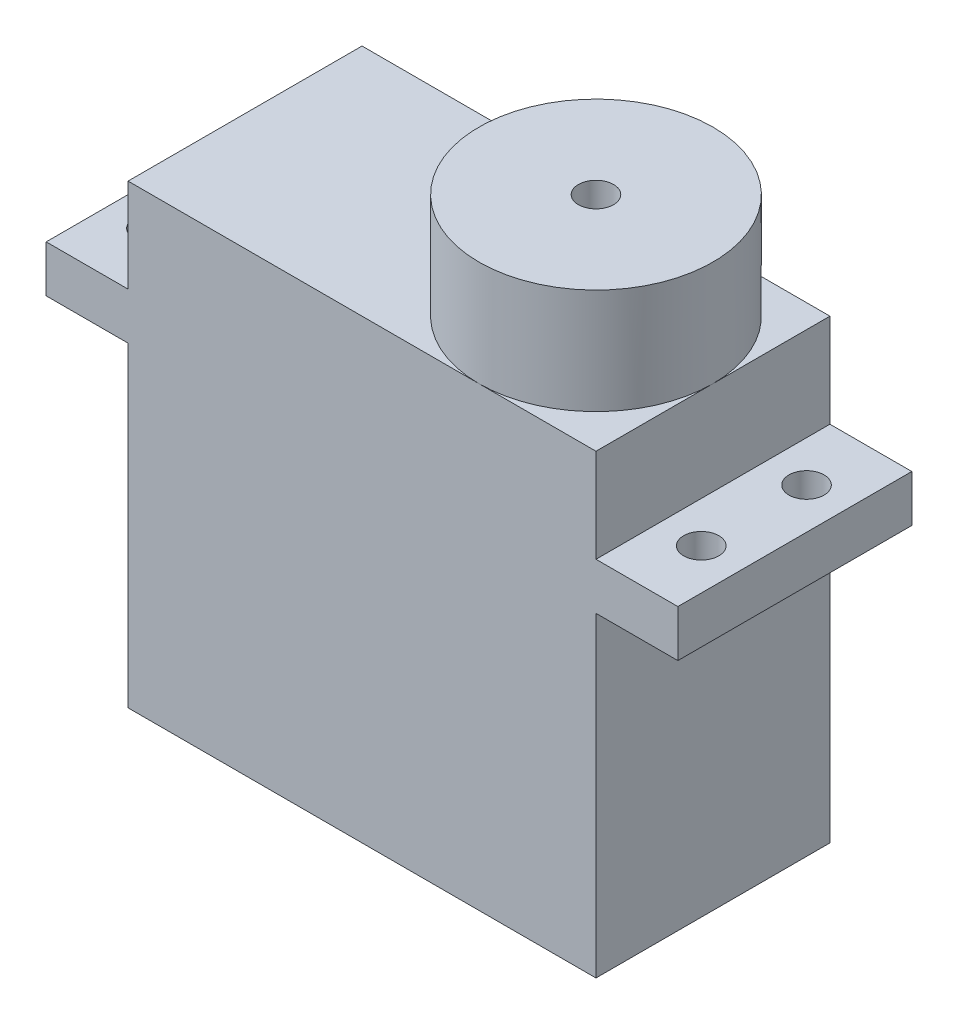
ISO-10303-21;
HEADER;
FILE_DESCRIPTION(('STEP AP214'),'2;1');
FILE_NAME('part.step','',(''),(''),'','','');
FILE_SCHEMA(('AUTOMOTIVE_DESIGN { 1 0 10303 214 1 1 1 1 }'));
ENDSEC;
DATA;
#1=APPLICATION_CONTEXT('core data for automotive mechanical design processes');
#2=APPLICATION_PROTOCOL_DEFINITION('international standard','automotive_design',2000,#1);
#3=PRODUCT_CONTEXT('',#1,'mechanical');
#4=PRODUCT('Part','Part','',(#3));
#5=PRODUCT_RELATED_PRODUCT_CATEGORY('part','',(#4));
#6=PRODUCT_DEFINITION_FORMATION('','',#4);
#7=PRODUCT_DEFINITION_CONTEXT('part definition',#1,'design');
#8=PRODUCT_DEFINITION('design','',#6,#7);
#9=PRODUCT_DEFINITION_SHAPE('','',#8);
#10=(LENGTH_UNIT() NAMED_UNIT(*) SI_UNIT(.MILLI.,.METRE.));
#11=(NAMED_UNIT(*) PLANE_ANGLE_UNIT() SI_UNIT($,.RADIAN.));
#12=(NAMED_UNIT(*) SI_UNIT($,.STERADIAN.) SOLID_ANGLE_UNIT());
#13=UNCERTAINTY_MEASURE_WITH_UNIT(LENGTH_MEASURE(1.E-05),#10,'distance_accuracy_value','');
#14=(GEOMETRIC_REPRESENTATION_CONTEXT(3) GLOBAL_UNCERTAINTY_ASSIGNED_CONTEXT((#13)) GLOBAL_UNIT_ASSIGNED_CONTEXT((#10,
#11,#12)) REPRESENTATION_CONTEXT('',''));
#15=CARTESIAN_POINT('',(0.,0.,0.));
#16=DIRECTION('',(0.,0.,1.));
#17=DIRECTION('',(1.,0.,0.));
#18=AXIS2_PLACEMENT_3D('',#15,#16,#17);
#19=CARTESIAN_POINT('',(0.,39.,0.));
#20=DIRECTION('',(0.,-1.,0.));
#21=DIRECTION('',(0.,0.,-1.));
#22=AXIS2_PLACEMENT_3D('',#19,#20,#21);
#23=PLANE('',#22);
#24=CARTESIAN_POINT('',(9.99999999999999,39.,0.));
#25=DIRECTION('',(0.,1.,0.));
#26=DIRECTION('',(0.,0.,1.));
#27=AXIS2_PLACEMENT_3D('',#24,#25,#26);
#28=CIRCLE('',#27,10.);
#29=CARTESIAN_POINT('',(9.99999999999999,39.,10.));
#30=VERTEX_POINT('',#29);
#31=CARTESIAN_POINT('',(20.,39.,0.));
#32=VERTEX_POINT('',#31);
#33=EDGE_CURVE('E47',#30,#32,#28,.T.);
#34=ORIENTED_EDGE('',*,*,#33,.F.);
#35=DIRECTION('',(1.,0.,0.));
#36=VECTOR('',#35,1.);
#37=CARTESIAN_POINT('',(-20.,39.,10.));
#38=LINE('',#37,#36);
#39=CARTESIAN_POINT('',(20.,39.,10.));
#40=VERTEX_POINT('',#39);
#41=EDGE_CURVE('E142',#30,#40,#38,.T.);
#42=ORIENTED_EDGE('',*,*,#41,.T.);
#43=DIRECTION('',(0.,0.,-1.));
#44=VECTOR('',#43,1.);
#45=CARTESIAN_POINT('',(20.,39.,10.));
#46=LINE('',#45,#44);
#47=EDGE_CURVE('E154',#40,#32,#46,.T.);
#48=ORIENTED_EDGE('',*,*,#47,.T.);
#49=EDGE_LOOP('',(#34,#42,#48));
#50=FACE_BOUND('',#49,.T.);
#51=ADVANCED_FACE('F36',(#50),#23,.F.);
#52=CARTESIAN_POINT('',(9.99999999999999,39.,-10.));
#53=VERTEX_POINT('',#52);
#54=EDGE_CURVE('E11',#32,#53,#28,.T.);
#55=ORIENTED_EDGE('',*,*,#54,.F.);
#56=CARTESIAN_POINT('',(20.,39.,-10.));
#57=VERTEX_POINT('',#56);
#58=EDGE_CURVE('E293',#32,#57,#46,.T.);
#59=ORIENTED_EDGE('',*,*,#58,.T.);
#60=DIRECTION('',(-1.,0.,0.));
#61=VECTOR('',#60,1.);
#62=CARTESIAN_POINT('',(-20.,39.,-10.));
#63=LINE('',#62,#61);
#64=EDGE_CURVE('E298',#57,#53,#63,.T.);
#65=ORIENTED_EDGE('',*,*,#64,.T.);
#66=EDGE_LOOP('',(#55,#59,#65));
#67=FACE_BOUND('',#66,.T.);
#68=ADVANCED_FACE('F301',(#67),#23,.F.);
#69=CARTESIAN_POINT('',(-20.,39.,10.));
#70=DIRECTION('',(1.,0.,0.));
#71=DIRECTION('',(0.,0.,-1.));
#72=AXIS2_PLACEMENT_3D('',#69,#70,#71);
#73=PLANE('',#72);
#74=DIRECTION('',(0.,0.,1.));
#75=VECTOR('',#74,1.);
#76=CARTESIAN_POINT('',(-20.,27.,-18.0622577482985));
#77=LINE('',#76,#75);
#78=CARTESIAN_POINT('',(-20.,27.,-10.));
#79=VERTEX_POINT('',#78);
#80=CARTESIAN_POINT('',(-20.,27.,10.));
#81=VERTEX_POINT('',#80);
#82=EDGE_CURVE('E182',#79,#81,#77,.T.);
#83=ORIENTED_EDGE('',*,*,#82,.F.);
#84=DIRECTION('',(0.,-1.,0.));
#85=VECTOR('',#84,1.);
#86=CARTESIAN_POINT('',(-20.,39.,-10.));
#87=LINE('',#86,#85);
#88=CARTESIAN_POINT('',(-20.,0.,-10.));
#89=VERTEX_POINT('',#88);
#90=EDGE_CURVE('E195',#79,#89,#87,.T.);
#91=ORIENTED_EDGE('',*,*,#90,.T.);
#92=DIRECTION('',(0.,0.,1.));
#93=VECTOR('',#92,1.);
#94=CARTESIAN_POINT('',(-20.,0.,10.));
#95=LINE('',#94,#93);
#96=CARTESIAN_POINT('',(-20.,0.,10.));
#97=VERTEX_POINT('',#96);
#98=EDGE_CURVE('E277',#89,#97,#95,.T.);
#99=ORIENTED_EDGE('',*,*,#98,.T.);
#100=DIRECTION('',(0.,-1.,0.));
#101=VECTOR('',#100,1.);
#102=CARTESIAN_POINT('',(-20.,39.,10.));
#103=LINE('',#102,#101);
#104=EDGE_CURVE('E257',#81,#97,#103,.T.);
#105=ORIENTED_EDGE('',*,*,#104,.F.);
#106=EDGE_LOOP('',(#83,#91,#99,#105));
#107=FACE_BOUND('',#106,.T.);
#108=ADVANCED_FACE('F275',(#107),#73,.F.);
#109=CARTESIAN_POINT('',(20.,39.,10.));
#110=DIRECTION('',(-1.,0.,0.));
#111=DIRECTION('',(0.,0.,1.));
#112=AXIS2_PLACEMENT_3D('',#109,#110,#111);
#113=PLANE('',#112);
#114=DIRECTION('',(0.,0.,1.));
#115=VECTOR('',#114,1.);
#116=CARTESIAN_POINT('',(20.,31.,10.));
#117=LINE('',#116,#115);
#118=CARTESIAN_POINT('',(20.,31.,-10.));
#119=VERTEX_POINT('',#118);
#120=CARTESIAN_POINT('',(20.,31.,10.));
#121=VERTEX_POINT('',#120);
#122=EDGE_CURVE('E225',#119,#121,#117,.T.);
#123=ORIENTED_EDGE('',*,*,#122,.F.);
#124=DIRECTION('',(0.,-1.,0.));
#125=VECTOR('',#124,1.);
#126=CARTESIAN_POINT('',(20.,39.,-10.));
#127=LINE('',#126,#125);
#128=EDGE_CURVE('E159',#57,#119,#127,.T.);
#129=ORIENTED_EDGE('',*,*,#128,.F.);
#130=ORIENTED_EDGE('',*,*,#58,.F.);
#131=ORIENTED_EDGE('',*,*,#47,.F.);
#132=DIRECTION('',(0.,-1.,0.));
#133=VECTOR('',#132,1.);
#134=CARTESIAN_POINT('',(20.,39.,10.));
#135=LINE('',#134,#133);
#136=EDGE_CURVE('E149',#40,#121,#135,.T.);
#137=ORIENTED_EDGE('',*,*,#136,.T.);
#138=EDGE_LOOP('',(#123,#129,#130,#131,#137));
#139=FACE_BOUND('',#138,.T.);
#140=ADVANCED_FACE('F38',(#139),#113,.F.);
#141=DIRECTION('',(0.,0.,-1.));
#142=VECTOR('',#141,1.);
#143=CARTESIAN_POINT('',(20.,27.,-10.));
#144=LINE('',#143,#142);
#145=CARTESIAN_POINT('',(20.,27.,10.));
#146=VERTEX_POINT('',#145);
#147=CARTESIAN_POINT('',(20.,27.,-10.));
#148=VERTEX_POINT('',#147);
#149=EDGE_CURVE('E232',#146,#148,#144,.T.);
#150=ORIENTED_EDGE('',*,*,#149,.F.);
#151=CARTESIAN_POINT('',(20.,0.,10.));
#152=VERTEX_POINT('',#151);
#153=EDGE_CURVE('E141',#146,#152,#135,.T.);
#154=ORIENTED_EDGE('',*,*,#153,.T.);
#155=DIRECTION('',(0.,0.,-1.));
#156=VECTOR('',#155,1.);
#157=CARTESIAN_POINT('',(20.,0.,10.));
#158=LINE('',#157,#156);
#159=CARTESIAN_POINT('',(20.,0.,-10.));
#160=VERTEX_POINT('',#159);
#161=EDGE_CURVE('E288',#152,#160,#158,.T.);
#162=ORIENTED_EDGE('',*,*,#161,.T.);
#163=EDGE_CURVE('E161',#148,#160,#127,.T.);
#164=ORIENTED_EDGE('',*,*,#163,.F.);
#165=EDGE_LOOP('',(#150,#154,#162,#164));
#166=FACE_BOUND('',#165,.T.);
#167=ADVANCED_FACE('F354',(#166),#113,.F.);
#168=CARTESIAN_POINT('',(-20.,39.,-10.));
#169=DIRECTION('',(0.,0.,1.));
#170=DIRECTION('',(1.,0.,0.));
#171=AXIS2_PLACEMENT_3D('',#168,#169,#170);
#172=PLANE('',#171);
#173=DIRECTION('',(-1.,0.,0.));
#174=VECTOR('',#173,1.);
#175=CARTESIAN_POINT('',(-20.,0.,-10.));
#176=LINE('',#175,#174);
#177=EDGE_CURVE('E282',#160,#89,#176,.T.);
#178=ORIENTED_EDGE('',*,*,#177,.T.);
#179=ORIENTED_EDGE('',*,*,#90,.F.);
#180=DIRECTION('',(-1.,0.,0.));
#181=VECTOR('',#180,1.);
#182=CARTESIAN_POINT('',(-27.,27.,-10.));
#183=LINE('',#182,#181);
#184=CARTESIAN_POINT('',(-27.,27.,-10.));
#185=VERTEX_POINT('',#184);
#186=EDGE_CURVE('E181',#79,#185,#183,.T.);
#187=ORIENTED_EDGE('',*,*,#186,.T.);
#188=DIRECTION('',(0.,1.,0.));
#189=VECTOR('',#188,1.);
#190=CARTESIAN_POINT('',(-27.,31.,-10.));
#191=LINE('',#190,#189);
#192=CARTESIAN_POINT('',(-27.,31.,-10.));
#193=VERTEX_POINT('',#192);
#194=EDGE_CURVE('E179',#185,#193,#191,.T.);
#195=ORIENTED_EDGE('',*,*,#194,.T.);
#196=DIRECTION('',(1.,0.,0.));
#197=VECTOR('',#196,1.);
#198=CARTESIAN_POINT('',(-20.,31.,-10.));
#199=LINE('',#198,#197);
#200=CARTESIAN_POINT('',(-20.,31.,-10.));
#201=VERTEX_POINT('',#200);
#202=EDGE_CURVE('E204',#193,#201,#199,.T.);
#203=ORIENTED_EDGE('',*,*,#202,.T.);
#204=CARTESIAN_POINT('',(-20.,39.,-10.));
#205=VERTEX_POINT('',#204);
#206=EDGE_CURVE('E267',#205,#201,#87,.T.);
#207=ORIENTED_EDGE('',*,*,#206,.F.);
#208=EDGE_CURVE('E299',#53,#205,#63,.T.);
#209=ORIENTED_EDGE('',*,*,#208,.F.);
#210=ORIENTED_EDGE('',*,*,#64,.F.);
#211=ORIENTED_EDGE('',*,*,#128,.T.);
#212=DIRECTION('',(-1.,0.,0.));
#213=VECTOR('',#212,1.);
#214=CARTESIAN_POINT('',(27.,31.,-10.));
#215=LINE('',#214,#213);
#216=CARTESIAN_POINT('',(27.,31.,-10.));
#217=VERTEX_POINT('',#216);
#218=EDGE_CURVE('E238',#217,#119,#215,.T.);
#219=ORIENTED_EDGE('',*,*,#218,.F.);
#220=DIRECTION('',(0.,1.,0.));
#221=VECTOR('',#220,1.);
#222=CARTESIAN_POINT('',(27.,31.,-10.));
#223=LINE('',#222,#221);
#224=CARTESIAN_POINT('',(27.,27.,-10.));
#225=VERTEX_POINT('',#224);
#226=EDGE_CURVE('E236',#225,#217,#223,.T.);
#227=ORIENTED_EDGE('',*,*,#226,.F.);
#228=DIRECTION('',(-1.,0.,0.));
#229=VECTOR('',#228,1.);
#230=CARTESIAN_POINT('',(27.,27.,-10.));
#231=LINE('',#230,#229);
#232=EDGE_CURVE('E251',#225,#148,#231,.T.);
#233=ORIENTED_EDGE('',*,*,#232,.T.);
#234=ORIENTED_EDGE('',*,*,#163,.T.);
#235=EDGE_LOOP('',(#178,#179,#187,#195,#203,#207,#209,#210,#211,#219,#227,#233,#234));
#236=FACE_BOUND('',#235,.T.);
#237=ADVANCED_FACE('F283',(#236),#172,.F.);
#238=ORIENTED_EDGE('',*,*,#206,.T.);
#239=DIRECTION('',(0.,0.,1.));
#240=VECTOR('',#239,1.);
#241=CARTESIAN_POINT('',(-20.,31.,-18.0622577482985));
#242=LINE('',#241,#240);
#243=CARTESIAN_POINT('',(-20.,31.,10.));
#244=VERTEX_POINT('',#243);
#245=EDGE_CURVE('E200',#201,#244,#242,.T.);
#246=ORIENTED_EDGE('',*,*,#245,.T.);
#247=CARTESIAN_POINT('',(-20.,39.,10.));
#248=VERTEX_POINT('',#247);
#249=EDGE_CURVE('E254',#248,#244,#103,.T.);
#250=ORIENTED_EDGE('',*,*,#249,.F.);
#251=DIRECTION('',(0.,0.,1.));
#252=VECTOR('',#251,1.);
#253=CARTESIAN_POINT('',(-20.,39.,10.));
#254=LINE('',#253,#252);
#255=EDGE_CURVE('E137',#205,#248,#254,.T.);
#256=ORIENTED_EDGE('',*,*,#255,.F.);
#257=EDGE_LOOP('',(#238,#246,#250,#256));
#258=FACE_BOUND('',#257,.T.);
#259=ADVANCED_FACE('F346',(#258),#73,.F.);
#260=CARTESIAN_POINT('',(-20.,39.,10.));
#261=DIRECTION('',(0.,0.,-1.));
#262=DIRECTION('',(-1.,0.,0.));
#263=AXIS2_PLACEMENT_3D('',#260,#261,#262);
#264=PLANE('',#263);
#265=DIRECTION('',(1.,0.,0.));
#266=VECTOR('',#265,1.);
#267=CARTESIAN_POINT('',(-20.,0.,10.));
#268=LINE('',#267,#266);
#269=EDGE_CURVE('E291',#97,#152,#268,.T.);
#270=ORIENTED_EDGE('',*,*,#269,.T.);
#271=ORIENTED_EDGE('',*,*,#153,.F.);
#272=DIRECTION('',(-1.,0.,0.));
#273=VECTOR('',#272,1.);
#274=CARTESIAN_POINT('',(27.,27.,10.));
#275=LINE('',#274,#273);
#276=CARTESIAN_POINT('',(27.,27.,10.));
#277=VERTEX_POINT('',#276);
#278=EDGE_CURVE('E319',#277,#146,#275,.T.);
#279=ORIENTED_EDGE('',*,*,#278,.F.);
#280=DIRECTION('',(0.,-1.,0.));
#281=VECTOR('',#280,1.);
#282=CARTESIAN_POINT('',(27.,31.,10.));
#283=LINE('',#282,#281);
#284=CARTESIAN_POINT('',(27.,31.,10.));
#285=VERTEX_POINT('',#284);
#286=EDGE_CURVE('E231',#285,#277,#283,.T.);
#287=ORIENTED_EDGE('',*,*,#286,.F.);
#288=DIRECTION('',(-1.,0.,0.));
#289=VECTOR('',#288,1.);
#290=CARTESIAN_POINT('',(27.,31.,10.));
#291=LINE('',#290,#289);
#292=EDGE_CURVE('E295',#285,#121,#291,.T.);
#293=ORIENTED_EDGE('',*,*,#292,.T.);
#294=ORIENTED_EDGE('',*,*,#136,.F.);
#295=ORIENTED_EDGE('',*,*,#41,.F.);
#296=EDGE_CURVE('E133',#248,#30,#38,.T.);
#297=ORIENTED_EDGE('',*,*,#296,.F.);
#298=ORIENTED_EDGE('',*,*,#249,.T.);
#299=DIRECTION('',(-1.,0.,0.));
#300=VECTOR('',#299,1.);
#301=CARTESIAN_POINT('',(-20.,31.,10.));
#302=LINE('',#301,#300);
#303=CARTESIAN_POINT('',(-27.,31.,10.));
#304=VERTEX_POINT('',#303);
#305=EDGE_CURVE('E176',#244,#304,#302,.T.);
#306=ORIENTED_EDGE('',*,*,#305,.T.);
#307=DIRECTION('',(0.,-1.,0.));
#308=VECTOR('',#307,1.);
#309=CARTESIAN_POINT('',(-27.,31.,10.));
#310=LINE('',#309,#308);
#311=CARTESIAN_POINT('',(-27.,27.,10.));
#312=VERTEX_POINT('',#311);
#313=EDGE_CURVE('E183',#304,#312,#310,.T.);
#314=ORIENTED_EDGE('',*,*,#313,.T.);
#315=DIRECTION('',(1.,0.,0.));
#316=VECTOR('',#315,1.);
#317=CARTESIAN_POINT('',(-27.,27.,10.));
#318=LINE('',#317,#316);
#319=EDGE_CURVE('E186',#312,#81,#318,.T.);
#320=ORIENTED_EDGE('',*,*,#319,.T.);
#321=ORIENTED_EDGE('',*,*,#104,.T.);
#322=EDGE_LOOP('',(#270,#271,#279,#287,#293,#294,#295,#297,#298,#306,#314,#320,#321));
#323=FACE_BOUND('',#322,.T.);
#324=ADVANCED_FACE('F147',(#323),#264,.F.);
#325=EDGE_CURVE('E45',#53,#30,#28,.T.);
#326=ORIENTED_EDGE('',*,*,#325,.F.);
#327=ORIENTED_EDGE('',*,*,#208,.T.);
#328=ORIENTED_EDGE('',*,*,#255,.T.);
#329=ORIENTED_EDGE('',*,*,#296,.T.);
#330=EDGE_LOOP('',(#326,#327,#328,#329));
#331=FACE_BOUND('',#330,.T.);
#332=ADVANCED_FACE('F135',(#331),#23,.F.);
#333=CARTESIAN_POINT('',(0.,0.,0.));
#334=DIRECTION('',(0.,-1.,0.));
#335=DIRECTION('',(0.,0.,-1.));
#336=AXIS2_PLACEMENT_3D('',#333,#334,#335);
#337=PLANE('',#336);
#338=ORIENTED_EDGE('',*,*,#161,.F.);
#339=ORIENTED_EDGE('',*,*,#269,.F.);
#340=ORIENTED_EDGE('',*,*,#98,.F.);
#341=ORIENTED_EDGE('',*,*,#177,.F.);
#342=EDGE_LOOP('',(#338,#339,#340,#341));
#343=FACE_BOUND('',#342,.T.);
#344=ADVANCED_FACE('F290',(#343),#337,.T.);
#345=CARTESIAN_POINT('',(27.,31.,10.));
#346=DIRECTION('',(0.,-1.,0.));
#347=DIRECTION('',(0.,0.,-1.));
#348=AXIS2_PLACEMENT_3D('',#345,#346,#347);
#349=PLANE('',#348);
#350=CARTESIAN_POINT('',(23.5,31.,4.5));
#351=DIRECTION('',(0.,1.,0.));
#352=DIRECTION('',(0.,0.,1.));
#353=AXIS2_PLACEMENT_3D('',#350,#351,#352);
#354=CIRCLE('',#353,1.5);
#355=CARTESIAN_POINT('',(23.5,31.,6.));
#356=VERTEX_POINT('',#355);
#357=EDGE_CURVE('E209',#356,#356,#354,.T.);
#358=ORIENTED_EDGE('',*,*,#357,.F.);
#359=EDGE_LOOP('',(#358));
#360=FACE_BOUND('',#359,.T.);
#361=CARTESIAN_POINT('',(23.5,31.,-4.5));
#362=DIRECTION('',(0.,1.,0.));
#363=DIRECTION('',(0.,0.,1.));
#364=AXIS2_PLACEMENT_3D('',#361,#362,#363);
#365=CIRCLE('',#364,1.5);
#366=CARTESIAN_POINT('',(23.5,31.,-3.));
#367=VERTEX_POINT('',#366);
#368=EDGE_CURVE('E219',#367,#367,#365,.T.);
#369=ORIENTED_EDGE('',*,*,#368,.F.);
#370=EDGE_LOOP('',(#369));
#371=FACE_BOUND('',#370,.T.);
#372=ORIENTED_EDGE('',*,*,#122,.T.);
#373=ORIENTED_EDGE('',*,*,#292,.F.);
#374=DIRECTION('',(0.,0.,1.));
#375=VECTOR('',#374,1.);
#376=CARTESIAN_POINT('',(27.,31.,10.));
#377=LINE('',#376,#375);
#378=EDGE_CURVE('E228',#217,#285,#377,.T.);
#379=ORIENTED_EDGE('',*,*,#378,.F.);
#380=ORIENTED_EDGE('',*,*,#218,.T.);
#381=EDGE_LOOP('',(#372,#373,#379,#380));
#382=FACE_BOUND('',#381,.T.);
#383=ADVANCED_FACE('F307',(#360,#371,#382),#349,.F.);
#384=CARTESIAN_POINT('',(27.,27.,-10.));
#385=DIRECTION('',(0.,1.,0.));
#386=DIRECTION('',(0.,0.,1.));
#387=AXIS2_PLACEMENT_3D('',#384,#385,#386);
#388=PLANE('',#387);
#389=CARTESIAN_POINT('',(23.5,27.,4.5));
#390=DIRECTION('',(0.,1.,0.));
#391=DIRECTION('',(0.,0.,1.));
#392=AXIS2_PLACEMENT_3D('',#389,#390,#391);
#393=CIRCLE('',#392,1.5);
#394=CARTESIAN_POINT('',(23.5,27.,6.));
#395=VERTEX_POINT('',#394);
#396=EDGE_CURVE('E216',#395,#395,#393,.T.);
#397=ORIENTED_EDGE('',*,*,#396,.T.);
#398=EDGE_LOOP('',(#397));
#399=FACE_BOUND('',#398,.T.);
#400=CARTESIAN_POINT('',(23.5,27.,-4.5));
#401=DIRECTION('',(0.,1.,0.));
#402=DIRECTION('',(0.,0.,1.));
#403=AXIS2_PLACEMENT_3D('',#400,#401,#402);
#404=CIRCLE('',#403,1.5);
#405=CARTESIAN_POINT('',(23.5,27.,-3.));
#406=VERTEX_POINT('',#405);
#407=EDGE_CURVE('E222',#406,#406,#404,.T.);
#408=ORIENTED_EDGE('',*,*,#407,.T.);
#409=EDGE_LOOP('',(#408));
#410=FACE_BOUND('',#409,.T.);
#411=ORIENTED_EDGE('',*,*,#149,.T.);
#412=ORIENTED_EDGE('',*,*,#232,.F.);
#413=DIRECTION('',(0.,0.,-1.));
#414=VECTOR('',#413,1.);
#415=CARTESIAN_POINT('',(27.,27.,-10.));
#416=LINE('',#415,#414);
#417=EDGE_CURVE('E234',#277,#225,#416,.T.);
#418=ORIENTED_EDGE('',*,*,#417,.F.);
#419=ORIENTED_EDGE('',*,*,#278,.T.);
#420=EDGE_LOOP('',(#411,#412,#418,#419));
#421=FACE_BOUND('',#420,.T.);
#422=ADVANCED_FACE('F318',(#399,#410,#421),#388,.F.);
#423=CARTESIAN_POINT('',(27.,0.,0.));
#424=DIRECTION('',(-1.,0.,0.));
#425=DIRECTION('',(0.,0.,1.));
#426=AXIS2_PLACEMENT_3D('',#423,#424,#425);
#427=PLANE('',#426);
#428=ORIENTED_EDGE('',*,*,#378,.T.);
#429=ORIENTED_EDGE('',*,*,#286,.T.);
#430=ORIENTED_EDGE('',*,*,#417,.T.);
#431=ORIENTED_EDGE('',*,*,#226,.T.);
#432=EDGE_LOOP('',(#428,#429,#430,#431));
#433=FACE_BOUND('',#432,.T.);
#434=ADVANCED_FACE('F312',(#433),#427,.F.);
#435=CARTESIAN_POINT('',(23.5,27.,-4.5));
#436=DIRECTION('',(0.,1.,0.));
#437=DIRECTION('',(0.,0.,1.));
#438=AXIS2_PLACEMENT_3D('',#435,#436,#437);
#439=CYLINDRICAL_SURFACE('',#438,1.5);
#440=ORIENTED_EDGE('',*,*,#407,.F.);
#441=EDGE_LOOP('',(#440));
#442=FACE_BOUND('',#441,.T.);
#443=ORIENTED_EDGE('',*,*,#368,.T.);
#444=EDGE_LOOP('',(#443));
#445=FACE_BOUND('',#444,.T.);
#446=ADVANCED_FACE('F381',(#442,#445),#439,.F.);
#447=CARTESIAN_POINT('',(23.5,27.,4.5));
#448=DIRECTION('',(0.,1.,0.));
#449=DIRECTION('',(0.,0.,1.));
#450=AXIS2_PLACEMENT_3D('',#447,#448,#449);
#451=CYLINDRICAL_SURFACE('',#450,1.5);
#452=ORIENTED_EDGE('',*,*,#396,.F.);
#453=EDGE_LOOP('',(#452));
#454=FACE_BOUND('',#453,.T.);
#455=ORIENTED_EDGE('',*,*,#357,.T.);
#456=EDGE_LOOP('',(#455));
#457=FACE_BOUND('',#456,.T.);
#458=ADVANCED_FACE('F384',(#454,#457),#451,.F.);
#459=CARTESIAN_POINT('',(-27.,27.,-18.0622577482985));
#460=DIRECTION('',(0.,-1.,0.));
#461=DIRECTION('',(0.,0.,-1.));
#462=AXIS2_PLACEMENT_3D('',#459,#460,#461);
#463=PLANE('',#462);
#464=CARTESIAN_POINT('',(-23.5,27.,-4.5));
#465=DIRECTION('',(0.,1.,0.));
#466=DIRECTION('',(0.,0.,1.));
#467=AXIS2_PLACEMENT_3D('',#464,#465,#466);
#468=CIRCLE('',#467,1.5);
#469=CARTESIAN_POINT('',(-23.5,27.,-3.));
#470=VERTEX_POINT('',#469);
#471=EDGE_CURVE('E166',#470,#470,#468,.T.);
#472=ORIENTED_EDGE('',*,*,#471,.T.);
#473=EDGE_LOOP('',(#472));
#474=FACE_BOUND('',#473,.T.);
#475=CARTESIAN_POINT('',(-23.5,27.,4.5));
#476=DIRECTION('',(0.,1.,0.));
#477=DIRECTION('',(0.,0.,1.));
#478=AXIS2_PLACEMENT_3D('',#475,#476,#477);
#479=CIRCLE('',#478,1.5);
#480=CARTESIAN_POINT('',(-23.5,27.,6.));
#481=VERTEX_POINT('',#480);
#482=EDGE_CURVE('E173',#481,#481,#479,.T.);
#483=ORIENTED_EDGE('',*,*,#482,.T.);
#484=EDGE_LOOP('',(#483));
#485=FACE_BOUND('',#484,.T.);
#486=ORIENTED_EDGE('',*,*,#186,.F.);
#487=ORIENTED_EDGE('',*,*,#82,.T.);
#488=ORIENTED_EDGE('',*,*,#319,.F.);
#489=DIRECTION('',(0.,0.,1.));
#490=VECTOR('',#489,1.);
#491=CARTESIAN_POINT('',(-27.,27.,-18.0622577482985));
#492=LINE('',#491,#490);
#493=EDGE_CURVE('E189',#185,#312,#492,.T.);
#494=ORIENTED_EDGE('',*,*,#493,.F.);
#495=EDGE_LOOP('',(#486,#487,#488,#494));
#496=FACE_BOUND('',#495,.T.);
#497=ADVANCED_FACE('F333',(#474,#485,#496),#463,.T.);
#498=CARTESIAN_POINT('',(-27.,31.,-18.0622577482985));
#499=DIRECTION('',(-1.,0.,0.));
#500=DIRECTION('',(0.,0.,1.));
#501=AXIS2_PLACEMENT_3D('',#498,#499,#500);
#502=PLANE('',#501);
#503=ORIENTED_EDGE('',*,*,#194,.F.);
#504=ORIENTED_EDGE('',*,*,#493,.T.);
#505=ORIENTED_EDGE('',*,*,#313,.F.);
#506=DIRECTION('',(0.,0.,1.));
#507=VECTOR('',#506,1.);
#508=CARTESIAN_POINT('',(-27.,31.,-18.0622577482985));
#509=LINE('',#508,#507);
#510=EDGE_CURVE('E213',#193,#304,#509,.T.);
#511=ORIENTED_EDGE('',*,*,#510,.F.);
#512=EDGE_LOOP('',(#503,#504,#505,#511));
#513=FACE_BOUND('',#512,.T.);
#514=ADVANCED_FACE('F338',(#513),#502,.T.);
#515=CARTESIAN_POINT('',(-20.,31.,-18.0622577482985));
#516=DIRECTION('',(0.,1.,0.));
#517=DIRECTION('',(0.,0.,1.));
#518=AXIS2_PLACEMENT_3D('',#515,#516,#517);
#519=PLANE('',#518);
#520=CARTESIAN_POINT('',(-23.5,31.,-4.5));
#521=DIRECTION('',(0.,1.,0.));
#522=DIRECTION('',(0.,0.,1.));
#523=AXIS2_PLACEMENT_3D('',#520,#521,#522);
#524=CIRCLE('',#523,1.5);
#525=CARTESIAN_POINT('',(-23.5,31.,-3.));
#526=VERTEX_POINT('',#525);
#527=EDGE_CURVE('E170',#526,#526,#524,.T.);
#528=ORIENTED_EDGE('',*,*,#527,.F.);
#529=EDGE_LOOP('',(#528));
#530=FACE_BOUND('',#529,.T.);
#531=CARTESIAN_POINT('',(-23.5,31.,4.5));
#532=DIRECTION('',(0.,1.,0.));
#533=DIRECTION('',(0.,0.,1.));
#534=AXIS2_PLACEMENT_3D('',#531,#532,#533);
#535=CIRCLE('',#534,1.5);
#536=CARTESIAN_POINT('',(-23.5,31.,6.));
#537=VERTEX_POINT('',#536);
#538=EDGE_CURVE('E169',#537,#537,#535,.T.);
#539=ORIENTED_EDGE('',*,*,#538,.F.);
#540=EDGE_LOOP('',(#539));
#541=FACE_BOUND('',#540,.T.);
#542=ORIENTED_EDGE('',*,*,#202,.F.);
#543=ORIENTED_EDGE('',*,*,#510,.T.);
#544=ORIENTED_EDGE('',*,*,#305,.F.);
#545=ORIENTED_EDGE('',*,*,#245,.F.);
#546=EDGE_LOOP('',(#542,#543,#544,#545));
#547=FACE_BOUND('',#546,.T.);
#548=ADVANCED_FACE('F345',(#530,#541,#547),#519,.T.);
#549=CARTESIAN_POINT('',(-23.5,27.,4.5));
#550=DIRECTION('',(0.,1.,0.));
#551=DIRECTION('',(0.,0.,1.));
#552=AXIS2_PLACEMENT_3D('',#549,#550,#551);
#553=CYLINDRICAL_SURFACE('',#552,1.5);
#554=ORIENTED_EDGE('',*,*,#482,.F.);
#555=EDGE_LOOP('',(#554));
#556=FACE_BOUND('',#555,.T.);
#557=ORIENTED_EDGE('',*,*,#538,.T.);
#558=EDGE_LOOP('',(#557));
#559=FACE_BOUND('',#558,.T.);
#560=ADVANCED_FACE('F391',(#556,#559),#553,.F.);
#561=CARTESIAN_POINT('',(-23.5,27.,-4.5));
#562=DIRECTION('',(0.,1.,0.));
#563=DIRECTION('',(0.,0.,1.));
#564=AXIS2_PLACEMENT_3D('',#561,#562,#563);
#565=CYLINDRICAL_SURFACE('',#564,1.5);
#566=ORIENTED_EDGE('',*,*,#471,.F.);
#567=EDGE_LOOP('',(#566));
#568=FACE_BOUND('',#567,.T.);
#569=ORIENTED_EDGE('',*,*,#527,.T.);
#570=EDGE_LOOP('',(#569));
#571=FACE_BOUND('',#570,.T.);
#572=ADVANCED_FACE('F400',(#568,#571),#565,.F.);
#573=CARTESIAN_POINT('',(9.99999999999999,48.,0.));
#574=DIRECTION('',(0.,-1.,0.));
#575=DIRECTION('',(0.,0.,-1.));
#576=AXIS2_PLACEMENT_3D('',#573,#574,#575);
#577=CYLINDRICAL_SURFACE('',#576,10.);
#578=CARTESIAN_POINT('',(9.99999999999999,48.,0.));
#579=DIRECTION('',(0.,1.,0.));
#580=DIRECTION('',(0.,0.,1.));
#581=AXIS2_PLACEMENT_3D('',#578,#579,#580);
#582=CIRCLE('',#581,10.);
#583=CARTESIAN_POINT('',(9.99999999999999,48.,10.));
#584=VERTEX_POINT('',#583);
#585=EDGE_CURVE('E156',#584,#584,#582,.T.);
#586=ORIENTED_EDGE('',*,*,#585,.F.);
#587=EDGE_LOOP('',(#586));
#588=FACE_BOUND('',#587,.T.);
#589=ORIENTED_EDGE('',*,*,#33,.T.);
#590=ORIENTED_EDGE('',*,*,#54,.T.);
#591=ORIENTED_EDGE('',*,*,#325,.T.);
#592=EDGE_LOOP('',(#589,#590,#591));
#593=FACE_BOUND('',#592,.T.);
#594=ADVANCED_FACE('F158',(#588,#593),#577,.T.);
#595=CARTESIAN_POINT('',(9.99999999999999,48.,0.));
#596=DIRECTION('',(0.,1.,0.));
#597=DIRECTION('',(0.,0.,1.));
#598=AXIS2_PLACEMENT_3D('',#595,#596,#597);
#599=PLANE('',#598);
#600=CARTESIAN_POINT('',(9.99999999999999,48.,0.));
#601=DIRECTION('',(0.,1.,0.));
#602=DIRECTION('',(0.,0.,1.));
#603=AXIS2_PLACEMENT_3D('',#600,#601,#602);
#604=CIRCLE('',#603,1.5);
#605=CARTESIAN_POINT('',(9.99999999999999,48.,1.5));
#606=VERTEX_POINT('',#605);
#607=EDGE_CURVE('E423',#606,#606,#604,.T.);
#608=ORIENTED_EDGE('',*,*,#607,.F.);
#609=EDGE_LOOP('',(#608));
#610=FACE_BOUND('',#609,.T.);
#611=ORIENTED_EDGE('',*,*,#585,.T.);
#612=EDGE_LOOP('',(#611));
#613=FACE_BOUND('',#612,.T.);
#614=ADVANCED_FACE('F407',(#610,#613),#599,.T.);
#615=CARTESIAN_POINT('',(9.99999999999999,42.,0.));
#616=DIRECTION('',(0.,1.,0.));
#617=DIRECTION('',(0.,0.,1.));
#618=AXIS2_PLACEMENT_3D('',#615,#616,#617);
#619=CYLINDRICAL_SURFACE('',#618,1.5);
#620=CARTESIAN_POINT('',(9.99999999999999,42.,0.));
#621=DIRECTION('',(0.,1.,0.));
#622=DIRECTION('',(0.,0.,1.));
#623=AXIS2_PLACEMENT_3D('',#620,#621,#622);
#624=CIRCLE('',#623,1.5);
#625=CARTESIAN_POINT('',(9.99999999999999,42.,1.5));
#626=VERTEX_POINT('',#625);
#627=EDGE_CURVE('E157',#626,#626,#624,.T.);
#628=ORIENTED_EDGE('',*,*,#627,.F.);
#629=EDGE_LOOP('',(#628));
#630=FACE_BOUND('',#629,.T.);
#631=ORIENTED_EDGE('',*,*,#607,.T.);
#632=EDGE_LOOP('',(#631));
#633=FACE_BOUND('',#632,.T.);
#634=ADVANCED_FACE('F411',(#630,#633),#619,.F.);
#635=CARTESIAN_POINT('',(9.99999999999999,42.,0.));
#636=DIRECTION('',(0.,1.,0.));
#637=DIRECTION('',(0.,0.,1.));
#638=AXIS2_PLACEMENT_3D('',#635,#636,#637);
#639=PLANE('',#638);
#640=ORIENTED_EDGE('',*,*,#627,.T.);
#641=EDGE_LOOP('',(#640));
#642=FACE_BOUND('',#641,.T.);
#643=ADVANCED_FACE('F415',(#642),#639,.T.);
#644=CLOSED_SHELL('',(#51,#68,#108,#140,#167,#237,#259,#324,#332,#344,#383,#422,#434,#446,#458,
#497,#514,#548,#560,#572,#594,#614,#634,#643));
#645=MANIFOLD_SOLID_BREP('B2',#644);
#646=ADVANCED_BREP_SHAPE_REPRESENTATION('',(#18,#645),#14);
#647=SHAPE_DEFINITION_REPRESENTATION(#9,#646);
ENDSEC;
END-ISO-10303-21;
